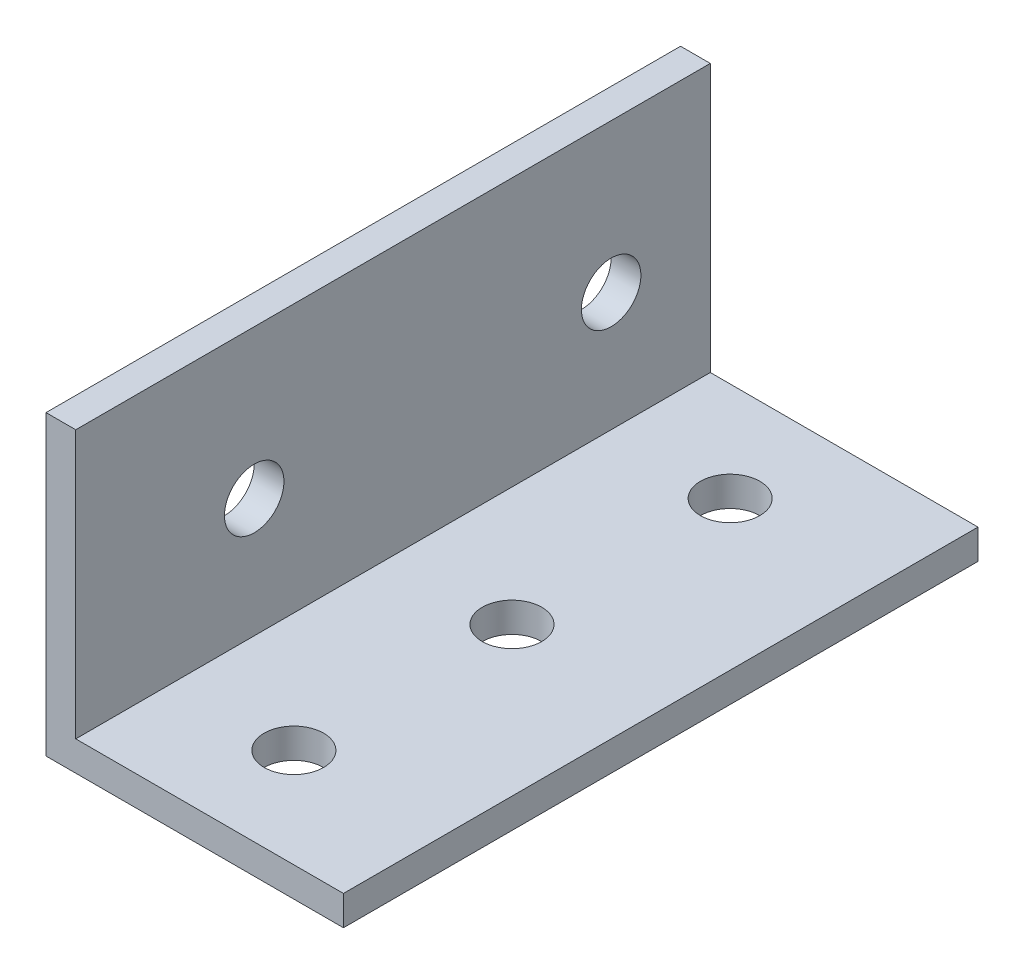
ISO-10303-21;
HEADER;
FILE_DESCRIPTION(('STEP AP214'),'2;1');
FILE_NAME('part.step','',(''),(''),'','','');
FILE_SCHEMA(('AUTOMOTIVE_DESIGN { 1 0 10303 214 1 1 1 1 }'));
ENDSEC;
DATA;
#1=APPLICATION_CONTEXT('core data for automotive mechanical design processes');
#2=APPLICATION_PROTOCOL_DEFINITION('international standard','automotive_design',2000,#1);
#3=PRODUCT_CONTEXT('',#1,'mechanical');
#4=PRODUCT('Part','Part','',(#3));
#5=PRODUCT_RELATED_PRODUCT_CATEGORY('part','',(#4));
#6=PRODUCT_DEFINITION_FORMATION('','',#4);
#7=PRODUCT_DEFINITION_CONTEXT('part definition',#1,'design');
#8=PRODUCT_DEFINITION('design','',#6,#7);
#9=PRODUCT_DEFINITION_SHAPE('','',#8);
#10=(LENGTH_UNIT() NAMED_UNIT(*) SI_UNIT(.MILLI.,.METRE.));
#11=(NAMED_UNIT(*) PLANE_ANGLE_UNIT() SI_UNIT($,.RADIAN.));
#12=(NAMED_UNIT(*) SI_UNIT($,.STERADIAN.) SOLID_ANGLE_UNIT());
#13=UNCERTAINTY_MEASURE_WITH_UNIT(LENGTH_MEASURE(1.E-05),#10,'distance_accuracy_value','');
#14=(GEOMETRIC_REPRESENTATION_CONTEXT(3) GLOBAL_UNCERTAINTY_ASSIGNED_CONTEXT((#13)) GLOBAL_UNIT_ASSIGNED_CONTEXT((#10,
#11,#12)) REPRESENTATION_CONTEXT('',''));
#15=CARTESIAN_POINT('',(0.,0.,0.));
#16=DIRECTION('',(0.,0.,1.));
#17=DIRECTION('',(1.,0.,0.));
#18=AXIS2_PLACEMENT_3D('',#15,#16,#17);
#19=CARTESIAN_POINT('',(-11.0379243694826,4.33119022316685,32.));
#20=DIRECTION('',(0.,-1.,0.));
#21=DIRECTION('',(1.,0.,0.));
#22=AXIS2_PLACEMENT_3D('',#19,#20,#21);
#23=PLANE('',#22);
#24=DIRECTION('',(-1.,0.,0.));
#25=VECTOR('',#24,1.);
#26=CARTESIAN_POINT('',(-11.0379243694826,4.33119022316685,0.));
#27=LINE('',#26,#25);
#28=CARTESIAN_POINT('',(-11.0379243694826,4.33119022316685,0.));
#29=VERTEX_POINT('',#28);
#30=CARTESIAN_POINT('',(-12.5379243694826,4.33119022316684,0.));
#31=VERTEX_POINT('',#30);
#32=EDGE_CURVE('E117',#29,#31,#27,.T.);
#33=ORIENTED_EDGE('',*,*,#32,.T.);
#34=DIRECTION('',(0.,0.,-1.));
#35=VECTOR('',#34,1.);
#36=CARTESIAN_POINT('',(-12.5379243694826,4.33119022316684,32.));
#37=LINE('',#36,#35);
#38=CARTESIAN_POINT('',(-12.5379243694826,4.33119022316684,32.));
#39=VERTEX_POINT('',#38);
#40=EDGE_CURVE('E11',#39,#31,#37,.T.);
#41=ORIENTED_EDGE('',*,*,#40,.F.);
#42=DIRECTION('',(-1.,0.,0.));
#43=VECTOR('',#42,1.);
#44=CARTESIAN_POINT('',(-11.0379243694826,4.33119022316685,32.));
#45=LINE('',#44,#43);
#46=CARTESIAN_POINT('',(-11.0379243694826,4.33119022316685,32.));
#47=VERTEX_POINT('',#46);
#48=EDGE_CURVE('E128',#47,#39,#45,.T.);
#49=ORIENTED_EDGE('',*,*,#48,.F.);
#50=DIRECTION('',(0.,0.,-1.));
#51=VECTOR('',#50,1.);
#52=CARTESIAN_POINT('',(-11.0379243694826,4.33119022316685,32.));
#53=LINE('',#52,#51);
#54=EDGE_CURVE('E113',#47,#29,#53,.T.);
#55=ORIENTED_EDGE('',*,*,#54,.T.);
#56=EDGE_LOOP('',(#33,#41,#49,#55));
#57=FACE_BOUND('',#56,.T.);
#58=ADVANCED_FACE('F31',(#57),#23,.F.);
#59=CARTESIAN_POINT('',(-12.5379243694826,4.33119022316684,32.));
#60=DIRECTION('',(1.,0.,0.));
#61=DIRECTION('',(0.,1.,0.));
#62=AXIS2_PLACEMENT_3D('',#59,#60,#61);
#63=PLANE('',#62);
#64=CARTESIAN_POINT('',(-12.5379243694826,-3.16880977683315,5.));
#65=DIRECTION('',(-1.,0.,0.));
#66=DIRECTION('',(0.,-1.,0.));
#67=AXIS2_PLACEMENT_3D('',#64,#65,#66);
#68=CIRCLE('',#67,1.5);
#69=CARTESIAN_POINT('',(-12.5379243694826,-4.66880977683315,5.));
#70=VERTEX_POINT('',#69);
#71=EDGE_CURVE('E140',#70,#70,#68,.T.);
#72=ORIENTED_EDGE('',*,*,#71,.F.);
#73=EDGE_LOOP('',(#72));
#74=FACE_BOUND('',#73,.T.);
#75=CARTESIAN_POINT('',(-12.5379243694826,-3.16880977683315,23.));
#76=DIRECTION('',(-1.,0.,0.));
#77=DIRECTION('',(0.,-1.,0.));
#78=AXIS2_PLACEMENT_3D('',#75,#76,#77);
#79=CIRCLE('',#78,1.5);
#80=CARTESIAN_POINT('',(-12.5379243694826,-4.66880977683316,23.));
#81=VERTEX_POINT('',#80);
#82=EDGE_CURVE('E136',#81,#81,#79,.T.);
#83=ORIENTED_EDGE('',*,*,#82,.F.);
#84=EDGE_LOOP('',(#83));
#85=FACE_BOUND('',#84,.T.);
#86=DIRECTION('',(0.,-1.,0.));
#87=VECTOR('',#86,1.);
#88=CARTESIAN_POINT('',(-12.5379243694826,4.33119022316684,0.));
#89=LINE('',#88,#87);
#90=CARTESIAN_POINT('',(-12.5379243694826,-10.6688097768332,0.));
#91=VERTEX_POINT('',#90);
#92=EDGE_CURVE('E120',#31,#91,#89,.T.);
#93=ORIENTED_EDGE('',*,*,#92,.T.);
#94=DIRECTION('',(0.,0.,-1.));
#95=VECTOR('',#94,1.);
#96=CARTESIAN_POINT('',(-12.5379243694826,-10.6688097768332,32.));
#97=LINE('',#96,#95);
#98=CARTESIAN_POINT('',(-12.5379243694826,-10.6688097768332,32.));
#99=VERTEX_POINT('',#98);
#100=EDGE_CURVE('E40',#99,#91,#97,.T.);
#101=ORIENTED_EDGE('',*,*,#100,.F.);
#102=DIRECTION('',(0.,-1.,0.));
#103=VECTOR('',#102,1.);
#104=CARTESIAN_POINT('',(-12.5379243694826,4.33119022316684,32.));
#105=LINE('',#104,#103);
#106=EDGE_CURVE('E86',#39,#99,#105,.T.);
#107=ORIENTED_EDGE('',*,*,#106,.F.);
#108=ORIENTED_EDGE('',*,*,#40,.T.);
#109=EDGE_LOOP('',(#93,#101,#107,#108));
#110=FACE_BOUND('',#109,.T.);
#111=ADVANCED_FACE('F166',(#74,#85,#110),#63,.F.);
#112=CARTESIAN_POINT('',(-12.5379243694826,-10.6688097768332,32.));
#113=DIRECTION('',(0.,1.,0.));
#114=DIRECTION('',(0.,0.,1.));
#115=AXIS2_PLACEMENT_3D('',#112,#113,#114);
#116=PLANE('',#115);
#117=CARTESIAN_POINT('',(-5.03792436948262,-10.6688097768332,16.));
#118=DIRECTION('',(0.,-1.,0.));
#119=DIRECTION('',(0.,0.,-1.));
#120=AXIS2_PLACEMENT_3D('',#117,#118,#119);
#121=CIRCLE('',#120,1.5);
#122=CARTESIAN_POINT('',(-5.03792436948262,-10.6688097768332,14.5));
#123=VERTEX_POINT('',#122);
#124=EDGE_CURVE('E156',#123,#123,#121,.T.);
#125=ORIENTED_EDGE('',*,*,#124,.F.);
#126=EDGE_LOOP('',(#125));
#127=FACE_BOUND('',#126,.T.);
#128=CARTESIAN_POINT('',(-5.03792436948262,-10.6688097768332,27.));
#129=DIRECTION('',(0.,-1.,0.));
#130=DIRECTION('',(0.,0.,-1.));
#131=AXIS2_PLACEMENT_3D('',#128,#129,#130);
#132=CIRCLE('',#131,1.5);
#133=CARTESIAN_POINT('',(-5.03792436948262,-10.6688097768332,25.5));
#134=VERTEX_POINT('',#133);
#135=EDGE_CURVE('E146',#134,#134,#132,.T.);
#136=ORIENTED_EDGE('',*,*,#135,.F.);
#137=EDGE_LOOP('',(#136));
#138=FACE_BOUND('',#137,.T.);
#139=CARTESIAN_POINT('',(-5.03792436948262,-10.6688097768332,5.));
#140=DIRECTION('',(0.,-1.,0.));
#141=DIRECTION('',(0.,0.,-1.));
#142=AXIS2_PLACEMENT_3D('',#139,#140,#141);
#143=CIRCLE('',#142,1.5);
#144=CARTESIAN_POINT('',(-5.03792436948262,-10.6688097768332,3.5));
#145=VERTEX_POINT('',#144);
#146=EDGE_CURVE('E143',#145,#145,#143,.T.);
#147=ORIENTED_EDGE('',*,*,#146,.F.);
#148=EDGE_LOOP('',(#147));
#149=FACE_BOUND('',#148,.T.);
#150=DIRECTION('',(1.,0.,0.));
#151=VECTOR('',#150,1.);
#152=CARTESIAN_POINT('',(-12.5379243694826,-10.6688097768332,0.));
#153=LINE('',#152,#151);
#154=CARTESIAN_POINT('',(2.46207563051738,-10.6688097768332,0.));
#155=VERTEX_POINT('',#154);
#156=EDGE_CURVE('E123',#91,#155,#153,.T.);
#157=ORIENTED_EDGE('',*,*,#156,.T.);
#158=DIRECTION('',(0.,0.,-1.));
#159=VECTOR('',#158,1.);
#160=CARTESIAN_POINT('',(2.46207563051738,-10.6688097768332,32.));
#161=LINE('',#160,#159);
#162=CARTESIAN_POINT('',(2.46207563051738,-10.6688097768332,32.));
#163=VERTEX_POINT('',#162);
#164=EDGE_CURVE('E108',#163,#155,#161,.T.);
#165=ORIENTED_EDGE('',*,*,#164,.F.);
#166=DIRECTION('',(1.,0.,0.));
#167=VECTOR('',#166,1.);
#168=CARTESIAN_POINT('',(-12.5379243694826,-10.6688097768332,32.));
#169=LINE('',#168,#167);
#170=EDGE_CURVE('E99',#99,#163,#169,.T.);
#171=ORIENTED_EDGE('',*,*,#170,.F.);
#172=ORIENTED_EDGE('',*,*,#100,.T.);
#173=EDGE_LOOP('',(#157,#165,#171,#172));
#174=FACE_BOUND('',#173,.T.);
#175=ADVANCED_FACE('F169',(#127,#138,#149,#174),#116,.F.);
#176=CARTESIAN_POINT('',(2.46207563051738,-10.6688097768332,32.));
#177=DIRECTION('',(-1.,0.,0.));
#178=DIRECTION('',(0.,0.,1.));
#179=AXIS2_PLACEMENT_3D('',#176,#177,#178);
#180=PLANE('',#179);
#181=DIRECTION('',(0.,1.,0.));
#182=VECTOR('',#181,1.);
#183=CARTESIAN_POINT('',(2.46207563051738,-10.6688097768332,0.));
#184=LINE('',#183,#182);
#185=CARTESIAN_POINT('',(2.46207563051738,-9.16880977683316,0.));
#186=VERTEX_POINT('',#185);
#187=EDGE_CURVE('E107',#155,#186,#184,.T.);
#188=ORIENTED_EDGE('',*,*,#187,.T.);
#189=DIRECTION('',(0.,0.,-1.));
#190=VECTOR('',#189,1.);
#191=CARTESIAN_POINT('',(2.46207563051738,-9.16880977683316,32.));
#192=LINE('',#191,#190);
#193=CARTESIAN_POINT('',(2.46207563051738,-9.16880977683316,32.));
#194=VERTEX_POINT('',#193);
#195=EDGE_CURVE('E104',#194,#186,#192,.T.);
#196=ORIENTED_EDGE('',*,*,#195,.F.);
#197=DIRECTION('',(0.,1.,0.));
#198=VECTOR('',#197,1.);
#199=CARTESIAN_POINT('',(2.46207563051738,-10.6688097768332,32.));
#200=LINE('',#199,#198);
#201=EDGE_CURVE('E93',#163,#194,#200,.T.);
#202=ORIENTED_EDGE('',*,*,#201,.F.);
#203=ORIENTED_EDGE('',*,*,#164,.T.);
#204=EDGE_LOOP('',(#188,#196,#202,#203));
#205=FACE_BOUND('',#204,.T.);
#206=ADVANCED_FACE('F105',(#205),#180,.F.);
#207=CARTESIAN_POINT('',(2.46207563051738,-9.16880977683316,32.));
#208=DIRECTION('',(0.,-1.,0.));
#209=DIRECTION('',(1.,0.,0.));
#210=AXIS2_PLACEMENT_3D('',#207,#208,#209);
#211=PLANE('',#210);
#212=CARTESIAN_POINT('',(-5.03792436948262,-9.16880977683316,16.));
#213=DIRECTION('',(0.,-1.,0.));
#214=DIRECTION('',(1.,0.,0.));
#215=AXIS2_PLACEMENT_3D('',#212,#213,#214);
#216=CIRCLE('',#215,1.5);
#217=CARTESIAN_POINT('',(-3.53792436948262,-9.16880977683316,16.));
#218=VERTEX_POINT('',#217);
#219=EDGE_CURVE('E34',#218,#218,#216,.T.);
#220=ORIENTED_EDGE('',*,*,#219,.T.);
#221=EDGE_LOOP('',(#220));
#222=FACE_BOUND('',#221,.T.);
#223=CARTESIAN_POINT('',(-5.03792436948262,-9.16880977683316,27.));
#224=DIRECTION('',(0.,-1.,0.));
#225=DIRECTION('',(1.,0.,0.));
#226=AXIS2_PLACEMENT_3D('',#223,#224,#225);
#227=CIRCLE('',#226,1.5);
#228=CARTESIAN_POINT('',(-3.53792436948262,-9.16880977683316,27.));
#229=VERTEX_POINT('',#228);
#230=EDGE_CURVE('E144',#229,#229,#227,.T.);
#231=ORIENTED_EDGE('',*,*,#230,.T.);
#232=EDGE_LOOP('',(#231));
#233=FACE_BOUND('',#232,.T.);
#234=CARTESIAN_POINT('',(-5.03792436948262,-9.16880977683316,5.));
#235=DIRECTION('',(0.,-1.,0.));
#236=DIRECTION('',(1.,0.,0.));
#237=AXIS2_PLACEMENT_3D('',#234,#235,#236);
#238=CIRCLE('',#237,1.5);
#239=CARTESIAN_POINT('',(-3.53792436948262,-9.16880977683316,5.));
#240=VERTEX_POINT('',#239);
#241=EDGE_CURVE('E141',#240,#240,#238,.T.);
#242=ORIENTED_EDGE('',*,*,#241,.T.);
#243=EDGE_LOOP('',(#242));
#244=FACE_BOUND('',#243,.T.);
#245=DIRECTION('',(-1.,0.,0.));
#246=VECTOR('',#245,1.);
#247=CARTESIAN_POINT('',(2.46207563051738,-9.16880977683316,0.));
#248=LINE('',#247,#246);
#249=CARTESIAN_POINT('',(-11.0379243694826,-9.16880977683316,0.));
#250=VERTEX_POINT('',#249);
#251=EDGE_CURVE('E72',#186,#250,#248,.T.);
#252=ORIENTED_EDGE('',*,*,#251,.T.);
#253=DIRECTION('',(0.,0.,-1.));
#254=VECTOR('',#253,1.);
#255=CARTESIAN_POINT('',(-11.0379243694826,-9.16880977683316,32.));
#256=LINE('',#255,#254);
#257=CARTESIAN_POINT('',(-11.0379243694826,-9.16880977683316,32.));
#258=VERTEX_POINT('',#257);
#259=EDGE_CURVE('E109',#258,#250,#256,.T.);
#260=ORIENTED_EDGE('',*,*,#259,.F.);
#261=DIRECTION('',(-1.,0.,0.));
#262=VECTOR('',#261,1.);
#263=CARTESIAN_POINT('',(2.46207563051738,-9.16880977683316,32.));
#264=LINE('',#263,#262);
#265=EDGE_CURVE('E97',#194,#258,#264,.T.);
#266=ORIENTED_EDGE('',*,*,#265,.F.);
#267=ORIENTED_EDGE('',*,*,#195,.T.);
#268=EDGE_LOOP('',(#252,#260,#266,#267));
#269=FACE_BOUND('',#268,.T.);
#270=ADVANCED_FACE('F111',(#222,#233,#244,#269),#211,.F.);
#271=CARTESIAN_POINT('',(-11.0379243694826,-9.16880977683316,32.));
#272=DIRECTION('',(-1.,0.,0.));
#273=DIRECTION('',(0.,-1.,0.));
#274=AXIS2_PLACEMENT_3D('',#271,#272,#273);
#275=PLANE('',#274);
#276=CARTESIAN_POINT('',(-11.0379243694826,-3.16880977683315,5.));
#277=DIRECTION('',(-1.,0.,0.));
#278=DIRECTION('',(0.,-1.,0.));
#279=AXIS2_PLACEMENT_3D('',#276,#277,#278);
#280=CIRCLE('',#279,1.5);
#281=CARTESIAN_POINT('',(-11.0379243694826,-4.66880977683315,5.));
#282=VERTEX_POINT('',#281);
#283=EDGE_CURVE('E137',#282,#282,#280,.T.);
#284=ORIENTED_EDGE('',*,*,#283,.T.);
#285=EDGE_LOOP('',(#284));
#286=FACE_BOUND('',#285,.T.);
#287=CARTESIAN_POINT('',(-11.0379243694826,-3.16880977683315,23.));
#288=DIRECTION('',(-1.,0.,0.));
#289=DIRECTION('',(0.,-1.,0.));
#290=AXIS2_PLACEMENT_3D('',#287,#288,#289);
#291=CIRCLE('',#290,1.5);
#292=CARTESIAN_POINT('',(-11.0379243694826,-4.66880977683315,23.));
#293=VERTEX_POINT('',#292);
#294=EDGE_CURVE('E121',#293,#293,#291,.T.);
#295=ORIENTED_EDGE('',*,*,#294,.T.);
#296=EDGE_LOOP('',(#295));
#297=FACE_BOUND('',#296,.T.);
#298=DIRECTION('',(0.,1.,0.));
#299=VECTOR('',#298,1.);
#300=CARTESIAN_POINT('',(-11.0379243694826,-9.16880977683316,0.));
#301=LINE('',#300,#299);
#302=EDGE_CURVE('E78',#250,#29,#301,.T.);
#303=ORIENTED_EDGE('',*,*,#302,.T.);
#304=ORIENTED_EDGE('',*,*,#54,.F.);
#305=DIRECTION('',(0.,1.,0.));
#306=VECTOR('',#305,1.);
#307=CARTESIAN_POINT('',(-11.0379243694826,-9.16880977683316,32.));
#308=LINE('',#307,#306);
#309=EDGE_CURVE('E49',#258,#47,#308,.T.);
#310=ORIENTED_EDGE('',*,*,#309,.F.);
#311=ORIENTED_EDGE('',*,*,#259,.T.);
#312=EDGE_LOOP('',(#303,#304,#310,#311));
#313=FACE_BOUND('',#312,.T.);
#314=ADVANCED_FACE('F174',(#286,#297,#313),#275,.F.);
#315=CARTESIAN_POINT('',(-12.5379243694826,4.33119022316684,32.));
#316=DIRECTION('',(0.,0.,1.));
#317=DIRECTION('',(1.,0.,0.));
#318=AXIS2_PLACEMENT_3D('',#315,#316,#317);
#319=PLANE('',#318);
#320=ORIENTED_EDGE('',*,*,#48,.T.);
#321=ORIENTED_EDGE('',*,*,#106,.T.);
#322=ORIENTED_EDGE('',*,*,#170,.T.);
#323=ORIENTED_EDGE('',*,*,#201,.T.);
#324=ORIENTED_EDGE('',*,*,#265,.T.);
#325=ORIENTED_EDGE('',*,*,#309,.T.);
#326=EDGE_LOOP('',(#320,#321,#322,#323,#324,#325));
#327=FACE_BOUND('',#326,.T.);
#328=ADVANCED_FACE('F95',(#327),#319,.T.);
#329=CARTESIAN_POINT('',(-12.5379243694826,4.33119022316684,0.));
#330=DIRECTION('',(0.,0.,1.));
#331=DIRECTION('',(1.,0.,0.));
#332=AXIS2_PLACEMENT_3D('',#329,#330,#331);
#333=PLANE('',#332);
#334=ORIENTED_EDGE('',*,*,#32,.F.);
#335=ORIENTED_EDGE('',*,*,#302,.F.);
#336=ORIENTED_EDGE('',*,*,#251,.F.);
#337=ORIENTED_EDGE('',*,*,#187,.F.);
#338=ORIENTED_EDGE('',*,*,#156,.F.);
#339=ORIENTED_EDGE('',*,*,#92,.F.);
#340=EDGE_LOOP('',(#334,#335,#336,#337,#338,#339));
#341=FACE_BOUND('',#340,.T.);
#342=ADVANCED_FACE('F172',(#341),#333,.F.);
#343=CARTESIAN_POINT('',(12.4620756305174,-3.16880977683315,23.));
#344=DIRECTION('',(-1.,0.,0.));
#345=DIRECTION('',(0.,-1.,0.));
#346=AXIS2_PLACEMENT_3D('',#343,#344,#345);
#347=CYLINDRICAL_SURFACE('',#346,1.5);
#348=ORIENTED_EDGE('',*,*,#82,.T.);
#349=EDGE_LOOP('',(#348));
#350=FACE_BOUND('',#349,.T.);
#351=ORIENTED_EDGE('',*,*,#294,.F.);
#352=EDGE_LOOP('',(#351));
#353=FACE_BOUND('',#352,.T.);
#354=ADVANCED_FACE('F254',(#350,#353),#347,.F.);
#355=CARTESIAN_POINT('',(12.4620756305174,-3.16880977683315,5.));
#356=DIRECTION('',(-1.,0.,0.));
#357=DIRECTION('',(0.,-1.,0.));
#358=AXIS2_PLACEMENT_3D('',#355,#356,#357);
#359=CYLINDRICAL_SURFACE('',#358,1.5);
#360=ORIENTED_EDGE('',*,*,#71,.T.);
#361=EDGE_LOOP('',(#360));
#362=FACE_BOUND('',#361,.T.);
#363=ORIENTED_EDGE('',*,*,#283,.F.);
#364=EDGE_LOOP('',(#363));
#365=FACE_BOUND('',#364,.T.);
#366=ADVANCED_FACE('F225',(#362,#365),#359,.F.);
#367=CARTESIAN_POINT('',(-5.03792436948262,14.3311902231668,5.));
#368=DIRECTION('',(0.,-1.,0.));
#369=DIRECTION('',(0.,0.,-1.));
#370=AXIS2_PLACEMENT_3D('',#367,#368,#369);
#371=CYLINDRICAL_SURFACE('',#370,1.5);
#372=ORIENTED_EDGE('',*,*,#146,.T.);
#373=EDGE_LOOP('',(#372));
#374=FACE_BOUND('',#373,.T.);
#375=ORIENTED_EDGE('',*,*,#241,.F.);
#376=EDGE_LOOP('',(#375));
#377=FACE_BOUND('',#376,.T.);
#378=ADVANCED_FACE('F219',(#374,#377),#371,.F.);
#379=CARTESIAN_POINT('',(-5.03792436948262,14.3311902231668,27.));
#380=DIRECTION('',(0.,-1.,0.));
#381=DIRECTION('',(0.,0.,-1.));
#382=AXIS2_PLACEMENT_3D('',#379,#380,#381);
#383=CYLINDRICAL_SURFACE('',#382,1.5);
#384=ORIENTED_EDGE('',*,*,#135,.T.);
#385=EDGE_LOOP('',(#384));
#386=FACE_BOUND('',#385,.T.);
#387=ORIENTED_EDGE('',*,*,#230,.F.);
#388=EDGE_LOOP('',(#387));
#389=FACE_BOUND('',#388,.T.);
#390=ADVANCED_FACE('F224',(#386,#389),#383,.F.);
#391=CARTESIAN_POINT('',(-5.03792436948262,14.3311902231668,16.));
#392=DIRECTION('',(0.,-1.,0.));
#393=DIRECTION('',(0.,0.,-1.));
#394=AXIS2_PLACEMENT_3D('',#391,#392,#393);
#395=CYLINDRICAL_SURFACE('',#394,1.5);
#396=ORIENTED_EDGE('',*,*,#124,.T.);
#397=EDGE_LOOP('',(#396));
#398=FACE_BOUND('',#397,.T.);
#399=ORIENTED_EDGE('',*,*,#219,.F.);
#400=EDGE_LOOP('',(#399));
#401=FACE_BOUND('',#400,.T.);
#402=ADVANCED_FACE('F237',(#398,#401),#395,.F.);
#403=CLOSED_SHELL('',(#58,#111,#175,#206,#270,#314,#328,#342,#354,#366,#378,#390,#402));
#404=MANIFOLD_SOLID_BREP('B2',#403);
#405=ADVANCED_BREP_SHAPE_REPRESENTATION('',(#18,#404),#14);
#406=SHAPE_DEFINITION_REPRESENTATION(#9,#405);
ENDSEC;
END-ISO-10303-21;
